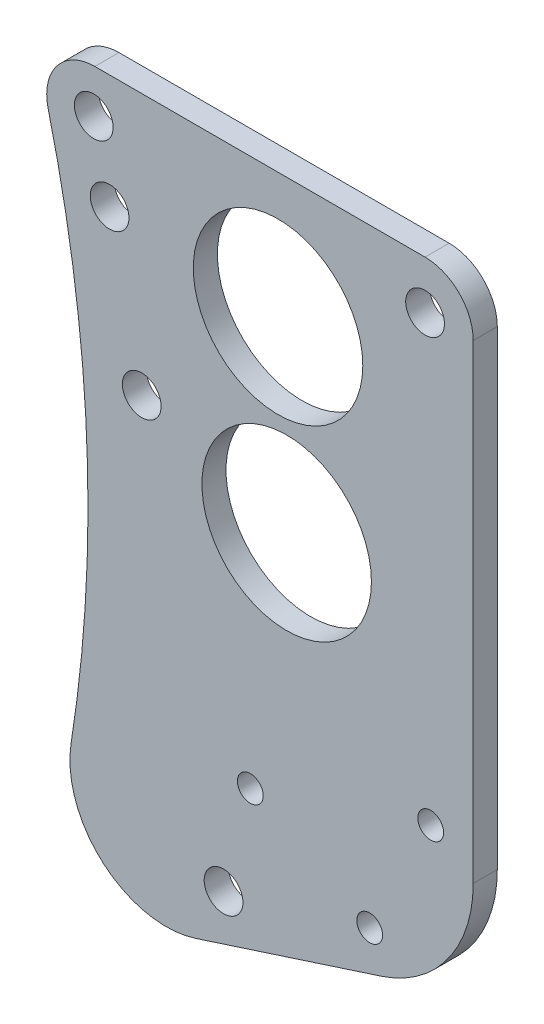
ISO-10303-21;
HEADER;
FILE_DESCRIPTION(('STEP AP214'),'2;1');
FILE_NAME('part.step','',(''),(''),'','','');
FILE_SCHEMA(('AUTOMOTIVE_DESIGN { 1 0 10303 214 1 1 1 1 }'));
ENDSEC;
DATA;
#1=APPLICATION_CONTEXT('core data for automotive mechanical design processes');
#2=APPLICATION_PROTOCOL_DEFINITION('international standard','automotive_design',2000,#1);
#3=PRODUCT_CONTEXT('',#1,'mechanical');
#4=PRODUCT('Part','Part','',(#3));
#5=PRODUCT_RELATED_PRODUCT_CATEGORY('part','',(#4));
#6=PRODUCT_DEFINITION_FORMATION('','',#4);
#7=PRODUCT_DEFINITION_CONTEXT('part definition',#1,'design');
#8=PRODUCT_DEFINITION('design','',#6,#7);
#9=PRODUCT_DEFINITION_SHAPE('','',#8);
#10=(LENGTH_UNIT() NAMED_UNIT(*) SI_UNIT(.MILLI.,.METRE.));
#11=(NAMED_UNIT(*) PLANE_ANGLE_UNIT() SI_UNIT($,.RADIAN.));
#12=(NAMED_UNIT(*) SI_UNIT($,.STERADIAN.) SOLID_ANGLE_UNIT());
#13=UNCERTAINTY_MEASURE_WITH_UNIT(LENGTH_MEASURE(1.E-05),#10,'distance_accuracy_value','');
#14=(GEOMETRIC_REPRESENTATION_CONTEXT(3) GLOBAL_UNCERTAINTY_ASSIGNED_CONTEXT((#13)) GLOBAL_UNIT_ASSIGNED_CONTEXT((#10,
#11,#12)) REPRESENTATION_CONTEXT('',''));
#15=CARTESIAN_POINT('',(0.,0.,0.));
#16=DIRECTION('',(0.,0.,1.));
#17=DIRECTION('',(1.,0.,0.));
#18=AXIS2_PLACEMENT_3D('',#15,#16,#17);
#19=CARTESIAN_POINT('',(122.2,93.8005999767423,3.175));
#20=DIRECTION('',(0.,0.,-1.));
#21=DIRECTION('',(-1.,0.,0.));
#22=AXIS2_PLACEMENT_3D('',#19,#20,#21);
#23=PLANE('',#22);
#24=CARTESIAN_POINT('',(122.2,93.8005999767423,3.175));
#25=DIRECTION('',(0.,0.,1.));
#26=DIRECTION('',(-1.,0.,0.));
#27=AXIS2_PLACEMENT_3D('',#24,#25,#26);
#28=CIRCLE('',#27,17.5000000000001);
#29=CARTESIAN_POINT('',(127.589632634249,77.1512198060617,3.175));
#30=VERTEX_POINT('',#29);
#31=CARTESIAN_POINT('',(139.7,93.8005999767423,3.175));
#32=VERTEX_POINT('',#31);
#33=EDGE_CURVE('E169',#30,#32,#28,.T.);
#34=ORIENTED_EDGE('',*,*,#33,.T.);
#35=DIRECTION('',(0.,1.,0.));
#36=VECTOR('',#35,1.);
#37=CARTESIAN_POINT('',(139.7,155.808224077225,3.175));
#38=LINE('',#37,#36);
#39=CARTESIAN_POINT('',(139.7,155.808224077225,3.175));
#40=VERTEX_POINT('',#39);
#41=EDGE_CURVE('E105',#32,#40,#38,.T.);
#42=ORIENTED_EDGE('',*,*,#41,.T.);
#43=CARTESIAN_POINT('',(133.35,155.808224077225,3.175));
#44=DIRECTION('',(0.,0.,1.));
#45=DIRECTION('',(-1.,0.,0.));
#46=AXIS2_PLACEMENT_3D('',#43,#44,#45);
#47=CIRCLE('',#46,6.34999999999999);
#48=CARTESIAN_POINT('',(133.35,162.158224077225,3.175));
#49=VERTEX_POINT('',#48);
#50=EDGE_CURVE('E190',#40,#49,#47,.T.);
#51=ORIENTED_EDGE('',*,*,#50,.T.);
#52=DIRECTION('',(-1.,0.,0.));
#53=VECTOR('',#52,1.);
#54=CARTESIAN_POINT('',(89.8048404492718,162.158224077225,3.175));
#55=LINE('',#54,#53);
#56=CARTESIAN_POINT('',(89.8048404492718,162.158224077225,3.175));
#57=VERTEX_POINT('',#56);
#58=EDGE_CURVE('E204',#49,#57,#55,.T.);
#59=ORIENTED_EDGE('',*,*,#58,.T.);
#60=CARTESIAN_POINT('',(89.8048404492718,155.808224077225,3.175));
#61=DIRECTION('',(0.,0.,1.));
#62=DIRECTION('',(-1.,0.,0.));
#63=AXIS2_PLACEMENT_3D('',#60,#61,#62);
#64=CIRCLE('',#63,6.35000000000002);
#65=CARTESIAN_POINT('',(83.6426045717097,154.275465456535,3.175));
#66=VERTEX_POINT('',#65);
#67=EDGE_CURVE('E124',#57,#66,#64,.T.);
#68=ORIENTED_EDGE('',*,*,#67,.T.);
#69=CARTESIAN_POINT('',(-88.8999999999996,111.358224077225,3.175));
#70=DIRECTION('',(0.,0.,-1.));
#71=DIRECTION('',(-1.,0.,0.));
#72=AXIS2_PLACEMENT_3D('',#69,#70,#71);
#73=CIRCLE('',#72,177.799999999998);
#74=CARTESIAN_POINT('',(86.6750199580798,83.318032089314,3.175));
#75=VERTEX_POINT('',#74);
#76=EDGE_CURVE('E118',#66,#75,#73,.T.);
#77=ORIENTED_EDGE('',*,*,#76,.T.);
#78=CARTESIAN_POINT('',(99.2160928122292,81.3151612330346,3.175));
#79=DIRECTION('',(0.,0.,1.));
#80=DIRECTION('',(1.,0.,0.));
#81=AXIS2_PLACEMENT_3D('',#78,#79,#80);
#82=CIRCLE('',#81,12.7000000000007);
#83=CARTESIAN_POINT('',(103.127426209655,69.232468194883,3.175));
#84=VERTEX_POINT('',#83);
#85=EDGE_CURVE('E122',#75,#84,#82,.T.);
#86=ORIENTED_EDGE('',*,*,#85,.T.);
#87=DIRECTION('',(0.951393152610311,0.307979007671323,0.));
#88=VECTOR('',#87,1.);
#89=CARTESIAN_POINT('',(127.589632634249,77.1512198060617,3.175));
#90=LINE('',#89,#88);
#91=EDGE_CURVE('E62',#84,#30,#90,.T.);
#92=ORIENTED_EDGE('',*,*,#91,.T.);
#93=EDGE_LOOP('',(#34,#42,#51,#59,#68,#77,#86,#92));
#94=FACE_BOUND('',#93,.T.);
#95=CARTESIAN_POINT('',(89.6578417367833,156.39509402059,3.175));
#96=DIRECTION('',(0.,0.,1.));
#97=DIRECTION('',(1.,0.,0.));
#98=AXIS2_PLACEMENT_3D('',#95,#96,#97);
#99=CIRCLE('',#98,2.5527000000171);
#100=CARTESIAN_POINT('',(92.2105417368004,156.39509402059,3.175));
#101=VERTEX_POINT('',#100);
#102=EDGE_CURVE('E151',#101,#101,#99,.T.);
#103=ORIENTED_EDGE('',*,*,#102,.F.);
#104=EDGE_LOOP('',(#103));
#105=FACE_BOUND('',#104,.T.);
#106=CARTESIAN_POINT('',(91.7477002278783,147.10218723707,3.175));
#107=DIRECTION('',(0.,0.,1.));
#108=DIRECTION('',(1.,0.,0.));
#109=AXIS2_PLACEMENT_3D('',#106,#107,#108);
#110=CIRCLE('',#109,2.55270000001633);
#111=CARTESIAN_POINT('',(94.3004002278947,147.10218723707,3.175));
#112=VERTEX_POINT('',#111);
#113=EDGE_CURVE('E218',#112,#112,#110,.T.);
#114=ORIENTED_EDGE('',*,*,#113,.F.);
#115=EDGE_LOOP('',(#114));
#116=FACE_BOUND('',#115,.T.);
#117=CARTESIAN_POINT('',(106.775437357423,76.4337086436564,3.175));
#118=DIRECTION('',(0.,0.,1.));
#119=DIRECTION('',(1.,0.,0.));
#120=AXIS2_PLACEMENT_3D('',#117,#118,#119);
#121=CIRCLE('',#120,2.55270000000014);
#122=CARTESIAN_POINT('',(109.328137357423,76.4337086436564,3.175));
#123=VERTEX_POINT('',#122);
#124=EDGE_CURVE('E226',#123,#123,#121,.T.);
#125=ORIENTED_EDGE('',*,*,#124,.F.);
#126=EDGE_LOOP('',(#125));
#127=FACE_BOUND('',#126,.T.);
#128=CARTESIAN_POINT('',(115.1001,121.545060725511,3.175));
#129=DIRECTION('',(0.,0.,1.));
#130=DIRECTION('',(1.,0.,0.));
#131=AXIS2_PLACEMENT_3D('',#128,#129,#130);
#132=CIRCLE('',#131,11.1760000000001);
#133=CARTESIAN_POINT('',(126.2761,121.545060725511,3.175));
#134=VERTEX_POINT('',#133);
#135=EDGE_CURVE('E234',#134,#134,#132,.T.);
#136=ORIENTED_EDGE('',*,*,#135,.F.);
#137=EDGE_LOOP('',(#136));
#138=FACE_BOUND('',#137,.T.);
#139=CARTESIAN_POINT('',(113.962375762482,145.648224077224,3.175));
#140=DIRECTION('',(0.,0.,1.));
#141=DIRECTION('',(1.,0.,0.));
#142=AXIS2_PLACEMENT_3D('',#139,#140,#141);
#143=CIRCLE('',#142,11.176);
#144=CARTESIAN_POINT('',(125.138375762482,145.648224077224,3.175));
#145=VERTEX_POINT('',#144);
#146=EDGE_CURVE('E242',#145,#145,#143,.T.);
#147=ORIENTED_EDGE('',*,*,#146,.F.);
#148=EDGE_LOOP('',(#147));
#149=FACE_BOUND('',#148,.T.);
#150=CARTESIAN_POINT('',(95.9884149323465,127.701170500752,3.175));
#151=DIRECTION('',(0.,0.,1.));
#152=DIRECTION('',(1.,0.,0.));
#153=AXIS2_PLACEMENT_3D('',#150,#151,#152);
#154=CIRCLE('',#153,2.55270000000033);
#155=CARTESIAN_POINT('',(98.5411149323469,127.701170500752,3.175));
#156=VERTEX_POINT('',#155);
#157=EDGE_CURVE('E250',#156,#156,#154,.T.);
#158=ORIENTED_EDGE('',*,*,#157,.F.);
#159=EDGE_LOOP('',(#158));
#160=FACE_BOUND('',#159,.T.);
#161=CARTESIAN_POINT('',(126.045534429459,81.9068257670201,3.175));
#162=DIRECTION('',(0.,0.,1.));
#163=DIRECTION('',(1.,0.,0.));
#164=AXIS2_PLACEMENT_3D('',#161,#162,#163);
#165=CIRCLE('',#164,1.70000000000001);
#166=CARTESIAN_POINT('',(127.745534429459,81.9068257670201,3.175));
#167=VERTEX_POINT('',#166);
#168=EDGE_CURVE('E258',#167,#167,#165,.T.);
#169=ORIENTED_EDGE('',*,*,#168,.F.);
#170=EDGE_LOOP('',(#169));
#171=FACE_BOUND('',#170,.T.);
#172=CARTESIAN_POINT('',(133.35,155.808224077225,3.175));
#173=DIRECTION('',(0.,0.,1.));
#174=DIRECTION('',(1.,0.,0.));
#175=AXIS2_PLACEMENT_3D('',#172,#173,#174);
#176=CIRCLE('',#175,2.55269999999999);
#177=CARTESIAN_POINT('',(135.9027,155.808224077225,3.175));
#178=VERTEX_POINT('',#177);
#179=EDGE_CURVE('E266',#178,#178,#176,.T.);
#180=ORIENTED_EDGE('',*,*,#179,.F.);
#181=EDGE_LOOP('',(#180));
#182=FACE_BOUND('',#181,.T.);
#183=CARTESIAN_POINT('',(134.093774209722,97.646134406201,3.175));
#184=DIRECTION('',(0.,0.,1.));
#185=DIRECTION('',(1.,0.,0.));
#186=AXIS2_PLACEMENT_3D('',#183,#184,#185);
#187=CIRCLE('',#186,1.70000000000004);
#188=CARTESIAN_POINT('',(135.793774209722,97.646134406201,3.175));
#189=VERTEX_POINT('',#188);
#190=EDGE_CURVE('E274',#189,#189,#187,.T.);
#191=ORIENTED_EDGE('',*,*,#190,.F.);
#192=EDGE_LOOP('',(#191));
#193=FACE_BOUND('',#192,.T.);
#194=CARTESIAN_POINT('',(110.306225790279,89.955065547283,3.175));
#195=DIRECTION('',(0.,0.,1.));
#196=DIRECTION('',(1.,0.,0.));
#197=AXIS2_PLACEMENT_3D('',#194,#195,#196);
#198=CIRCLE('',#197,1.7);
#199=CARTESIAN_POINT('',(112.006225790279,89.955065547283,3.175));
#200=VERTEX_POINT('',#199);
#201=EDGE_CURVE('E282',#200,#200,#198,.T.);
#202=ORIENTED_EDGE('',*,*,#201,.F.);
#203=EDGE_LOOP('',(#202));
#204=FACE_BOUND('',#203,.T.);
#205=ADVANCED_FACE('F44',(#94,#105,#116,#127,#138,#149,#160,#171,#182,#193,#204),#23,.F.);
#206=CARTESIAN_POINT('',(122.2,93.8005999767423,0.));
#207=DIRECTION('',(0.,0.,-1.));
#208=DIRECTION('',(-1.,0.,0.));
#209=AXIS2_PLACEMENT_3D('',#206,#207,#208);
#210=PLANE('',#209);
#211=CARTESIAN_POINT('',(134.093774209722,97.646134406201,0.));
#212=DIRECTION('',(0.,0.,1.));
#213=DIRECTION('',(1.,0.,0.));
#214=AXIS2_PLACEMENT_3D('',#211,#212,#213);
#215=CIRCLE('',#214,1.70000000000004);
#216=CARTESIAN_POINT('',(135.793774209722,97.646134406201,0.));
#217=VERTEX_POINT('',#216);
#218=EDGE_CURVE('E278',#217,#217,#215,.T.);
#219=ORIENTED_EDGE('',*,*,#218,.T.);
#220=EDGE_LOOP('',(#219));
#221=FACE_BOUND('',#220,.T.);
#222=CARTESIAN_POINT('',(126.045534429459,81.9068257670201,0.));
#223=DIRECTION('',(0.,0.,1.));
#224=DIRECTION('',(1.,0.,0.));
#225=AXIS2_PLACEMENT_3D('',#222,#223,#224);
#226=CIRCLE('',#225,1.70000000000001);
#227=CARTESIAN_POINT('',(127.745534429459,81.9068257670201,0.));
#228=VERTEX_POINT('',#227);
#229=EDGE_CURVE('E262',#228,#228,#226,.T.);
#230=ORIENTED_EDGE('',*,*,#229,.T.);
#231=EDGE_LOOP('',(#230));
#232=FACE_BOUND('',#231,.T.);
#233=CARTESIAN_POINT('',(113.962375762482,145.648224077224,0.));
#234=DIRECTION('',(0.,0.,1.));
#235=DIRECTION('',(1.,0.,0.));
#236=AXIS2_PLACEMENT_3D('',#233,#234,#235);
#237=CIRCLE('',#236,11.176);
#238=CARTESIAN_POINT('',(125.138375762482,145.648224077224,0.));
#239=VERTEX_POINT('',#238);
#240=EDGE_CURVE('E246',#239,#239,#237,.T.);
#241=ORIENTED_EDGE('',*,*,#240,.T.);
#242=EDGE_LOOP('',(#241));
#243=FACE_BOUND('',#242,.T.);
#244=CARTESIAN_POINT('',(106.775437357423,76.4337086436564,0.));
#245=DIRECTION('',(0.,0.,1.));
#246=DIRECTION('',(1.,0.,0.));
#247=AXIS2_PLACEMENT_3D('',#244,#245,#246);
#248=CIRCLE('',#247,2.55270000000014);
#249=CARTESIAN_POINT('',(109.328137357423,76.4337086436564,0.));
#250=VERTEX_POINT('',#249);
#251=EDGE_CURVE('E230',#250,#250,#248,.T.);
#252=ORIENTED_EDGE('',*,*,#251,.T.);
#253=EDGE_LOOP('',(#252));
#254=FACE_BOUND('',#253,.T.);
#255=CARTESIAN_POINT('',(89.6578417367833,156.39509402059,0.));
#256=DIRECTION('',(0.,0.,1.));
#257=DIRECTION('',(1.,0.,0.));
#258=AXIS2_PLACEMENT_3D('',#255,#256,#257);
#259=CIRCLE('',#258,2.5527000000171);
#260=CARTESIAN_POINT('',(92.2105417368004,156.39509402059,0.));
#261=VERTEX_POINT('',#260);
#262=EDGE_CURVE('E214',#261,#261,#259,.T.);
#263=ORIENTED_EDGE('',*,*,#262,.T.);
#264=EDGE_LOOP('',(#263));
#265=FACE_BOUND('',#264,.T.);
#266=CARTESIAN_POINT('',(122.2,93.8005999767423,0.));
#267=DIRECTION('',(0.,0.,1.));
#268=DIRECTION('',(-1.,0.,0.));
#269=AXIS2_PLACEMENT_3D('',#266,#267,#268);
#270=CIRCLE('',#269,17.5000000000001);
#271=CARTESIAN_POINT('',(127.589632634249,77.1512198060617,0.));
#272=VERTEX_POINT('',#271);
#273=CARTESIAN_POINT('',(139.7,93.8005999767423,0.));
#274=VERTEX_POINT('',#273);
#275=EDGE_CURVE('E146',#272,#274,#270,.T.);
#276=ORIENTED_EDGE('',*,*,#275,.F.);
#277=DIRECTION('',(0.951393152610311,0.307979007671323,0.));
#278=VECTOR('',#277,1.);
#279=CARTESIAN_POINT('',(127.589632634249,77.1512198060617,0.));
#280=LINE('',#279,#278);
#281=CARTESIAN_POINT('',(103.127426209655,69.232468194883,0.));
#282=VERTEX_POINT('',#281);
#283=EDGE_CURVE('E97',#282,#272,#280,.T.);
#284=ORIENTED_EDGE('',*,*,#283,.F.);
#285=CARTESIAN_POINT('',(99.2160928122292,81.3151612330346,0.));
#286=DIRECTION('',(0.,0.,1.));
#287=DIRECTION('',(1.,0.,0.));
#288=AXIS2_PLACEMENT_3D('',#285,#286,#287);
#289=CIRCLE('',#288,12.7000000000007);
#290=CARTESIAN_POINT('',(86.6750199580798,83.318032089314,0.));
#291=VERTEX_POINT('',#290);
#292=EDGE_CURVE('E91',#291,#282,#289,.T.);
#293=ORIENTED_EDGE('',*,*,#292,.F.);
#294=CARTESIAN_POINT('',(-88.8999999999996,111.358224077225,0.));
#295=DIRECTION('',(0.,0.,-1.));
#296=DIRECTION('',(-1.,0.,0.));
#297=AXIS2_PLACEMENT_3D('',#294,#295,#296);
#298=CIRCLE('',#297,177.799999999998);
#299=CARTESIAN_POINT('',(83.6426045717097,154.275465456535,0.));
#300=VERTEX_POINT('',#299);
#301=EDGE_CURVE('E133',#300,#291,#298,.T.);
#302=ORIENTED_EDGE('',*,*,#301,.F.);
#303=CARTESIAN_POINT('',(89.8048404492718,155.808224077225,0.));
#304=DIRECTION('',(0.,0.,1.));
#305=DIRECTION('',(-1.,0.,0.));
#306=AXIS2_PLACEMENT_3D('',#303,#304,#305);
#307=CIRCLE('',#306,6.35000000000002);
#308=CARTESIAN_POINT('',(89.8048404492718,162.158224077225,0.));
#309=VERTEX_POINT('',#308);
#310=EDGE_CURVE('E160',#309,#300,#307,.T.);
#311=ORIENTED_EDGE('',*,*,#310,.F.);
#312=DIRECTION('',(-1.,0.,0.));
#313=VECTOR('',#312,1.);
#314=CARTESIAN_POINT('',(89.8048404492718,162.158224077225,0.));
#315=LINE('',#314,#313);
#316=CARTESIAN_POINT('',(133.35,162.158224077225,0.));
#317=VERTEX_POINT('',#316);
#318=EDGE_CURVE('E157',#317,#309,#315,.T.);
#319=ORIENTED_EDGE('',*,*,#318,.F.);
#320=CARTESIAN_POINT('',(133.35,155.808224077225,0.));
#321=DIRECTION('',(0.,0.,1.));
#322=DIRECTION('',(-1.,0.,0.));
#323=AXIS2_PLACEMENT_3D('',#320,#321,#322);
#324=CIRCLE('',#323,6.34999999999999);
#325=CARTESIAN_POINT('',(139.7,155.808224077225,0.));
#326=VERTEX_POINT('',#325);
#327=EDGE_CURVE('E154',#326,#317,#324,.T.);
#328=ORIENTED_EDGE('',*,*,#327,.F.);
#329=DIRECTION('',(0.,1.,0.));
#330=VECTOR('',#329,1.);
#331=CARTESIAN_POINT('',(139.7,155.808224077225,0.));
#332=LINE('',#331,#330);
#333=EDGE_CURVE('E150',#274,#326,#332,.T.);
#334=ORIENTED_EDGE('',*,*,#333,.F.);
#335=EDGE_LOOP('',(#276,#284,#293,#302,#311,#319,#328,#334));
#336=FACE_BOUND('',#335,.T.);
#337=CARTESIAN_POINT('',(91.7477002278783,147.10218723707,0.));
#338=DIRECTION('',(0.,0.,1.));
#339=DIRECTION('',(1.,0.,0.));
#340=AXIS2_PLACEMENT_3D('',#337,#338,#339);
#341=CIRCLE('',#340,2.55270000001633);
#342=CARTESIAN_POINT('',(94.3004002278947,147.10218723707,0.));
#343=VERTEX_POINT('',#342);
#344=EDGE_CURVE('E222',#343,#343,#341,.T.);
#345=ORIENTED_EDGE('',*,*,#344,.T.);
#346=EDGE_LOOP('',(#345));
#347=FACE_BOUND('',#346,.T.);
#348=CARTESIAN_POINT('',(115.1001,121.545060725511,0.));
#349=DIRECTION('',(0.,0.,1.));
#350=DIRECTION('',(1.,0.,0.));
#351=AXIS2_PLACEMENT_3D('',#348,#349,#350);
#352=CIRCLE('',#351,11.1760000000001);
#353=CARTESIAN_POINT('',(126.2761,121.545060725511,0.));
#354=VERTEX_POINT('',#353);
#355=EDGE_CURVE('E238',#354,#354,#352,.T.);
#356=ORIENTED_EDGE('',*,*,#355,.T.);
#357=EDGE_LOOP('',(#356));
#358=FACE_BOUND('',#357,.T.);
#359=CARTESIAN_POINT('',(95.9884149323465,127.701170500752,0.));
#360=DIRECTION('',(0.,0.,1.));
#361=DIRECTION('',(1.,0.,0.));
#362=AXIS2_PLACEMENT_3D('',#359,#360,#361);
#363=CIRCLE('',#362,2.55270000000033);
#364=CARTESIAN_POINT('',(98.5411149323469,127.701170500752,0.));
#365=VERTEX_POINT('',#364);
#366=EDGE_CURVE('E254',#365,#365,#363,.T.);
#367=ORIENTED_EDGE('',*,*,#366,.T.);
#368=EDGE_LOOP('',(#367));
#369=FACE_BOUND('',#368,.T.);
#370=CARTESIAN_POINT('',(133.35,155.808224077225,0.));
#371=DIRECTION('',(0.,0.,1.));
#372=DIRECTION('',(1.,0.,0.));
#373=AXIS2_PLACEMENT_3D('',#370,#371,#372);
#374=CIRCLE('',#373,2.55269999999999);
#375=CARTESIAN_POINT('',(135.9027,155.808224077225,0.));
#376=VERTEX_POINT('',#375);
#377=EDGE_CURVE('E270',#376,#376,#374,.T.);
#378=ORIENTED_EDGE('',*,*,#377,.T.);
#379=EDGE_LOOP('',(#378));
#380=FACE_BOUND('',#379,.T.);
#381=CARTESIAN_POINT('',(110.306225790279,89.955065547283,0.));
#382=DIRECTION('',(0.,0.,1.));
#383=DIRECTION('',(1.,0.,0.));
#384=AXIS2_PLACEMENT_3D('',#381,#382,#383);
#385=CIRCLE('',#384,1.7);
#386=CARTESIAN_POINT('',(112.006225790279,89.955065547283,0.));
#387=VERTEX_POINT('',#386);
#388=EDGE_CURVE('E286',#387,#387,#385,.T.);
#389=ORIENTED_EDGE('',*,*,#388,.T.);
#390=EDGE_LOOP('',(#389));
#391=FACE_BOUND('',#390,.T.);
#392=ADVANCED_FACE('F194',(#221,#232,#243,#254,#265,#336,#347,#358,#369,#380,#391),#210,.T.);
#393=CARTESIAN_POINT('',(122.2,93.8005999767423,3.175));
#394=DIRECTION('',(0.,0.,-1.));
#395=DIRECTION('',(-1.,0.,0.));
#396=AXIS2_PLACEMENT_3D('',#393,#394,#395);
#397=CYLINDRICAL_SURFACE('',#396,17.5000000000001);
#398=ORIENTED_EDGE('',*,*,#275,.T.);
#399=DIRECTION('',(0.,0.,-1.));
#400=VECTOR('',#399,1.);
#401=CARTESIAN_POINT('',(139.7,93.8005999767423,3.175));
#402=LINE('',#401,#400);
#403=EDGE_CURVE('E11',#32,#274,#402,.T.);
#404=ORIENTED_EDGE('',*,*,#403,.F.);
#405=ORIENTED_EDGE('',*,*,#33,.F.);
#406=DIRECTION('',(0.,0.,-1.));
#407=VECTOR('',#406,1.);
#408=CARTESIAN_POINT('',(127.589632634249,77.1512198060617,3.175));
#409=LINE('',#408,#407);
#410=EDGE_CURVE('E142',#30,#272,#409,.T.);
#411=ORIENTED_EDGE('',*,*,#410,.T.);
#412=EDGE_LOOP('',(#398,#404,#405,#411));
#413=FACE_BOUND('',#412,.T.);
#414=ADVANCED_FACE('F46',(#413),#397,.T.);
#415=CARTESIAN_POINT('',(139.7,155.808224077225,3.175));
#416=DIRECTION('',(-1.,0.,0.));
#417=DIRECTION('',(0.,-1.,0.));
#418=AXIS2_PLACEMENT_3D('',#415,#416,#417);
#419=PLANE('',#418);
#420=ORIENTED_EDGE('',*,*,#333,.T.);
#421=DIRECTION('',(0.,0.,-1.));
#422=VECTOR('',#421,1.);
#423=CARTESIAN_POINT('',(139.7,155.808224077225,3.175));
#424=LINE('',#423,#422);
#425=EDGE_CURVE('E54',#40,#326,#424,.T.);
#426=ORIENTED_EDGE('',*,*,#425,.F.);
#427=ORIENTED_EDGE('',*,*,#41,.F.);
#428=ORIENTED_EDGE('',*,*,#403,.T.);
#429=EDGE_LOOP('',(#420,#426,#427,#428));
#430=FACE_BOUND('',#429,.T.);
#431=ADVANCED_FACE('F320',(#430),#419,.F.);
#432=CARTESIAN_POINT('',(133.35,155.808224077225,3.175));
#433=DIRECTION('',(0.,0.,-1.));
#434=DIRECTION('',(-1.,0.,0.));
#435=AXIS2_PLACEMENT_3D('',#432,#433,#434);
#436=CYLINDRICAL_SURFACE('',#435,6.34999999999999);
#437=ORIENTED_EDGE('',*,*,#327,.T.);
#438=DIRECTION('',(0.,0.,-1.));
#439=VECTOR('',#438,1.);
#440=CARTESIAN_POINT('',(133.35,162.158224077225,3.175));
#441=LINE('',#440,#439);
#442=EDGE_CURVE('E180',#49,#317,#441,.T.);
#443=ORIENTED_EDGE('',*,*,#442,.F.);
#444=ORIENTED_EDGE('',*,*,#50,.F.);
#445=ORIENTED_EDGE('',*,*,#425,.T.);
#446=EDGE_LOOP('',(#437,#443,#444,#445));
#447=FACE_BOUND('',#446,.T.);
#448=ADVANCED_FACE('F188',(#447),#436,.T.);
#449=CARTESIAN_POINT('',(89.8048404492718,162.158224077225,3.175));
#450=DIRECTION('',(0.,-1.,0.));
#451=DIRECTION('',(1.,0.,0.));
#452=AXIS2_PLACEMENT_3D('',#449,#450,#451);
#453=PLANE('',#452);
#454=ORIENTED_EDGE('',*,*,#318,.T.);
#455=DIRECTION('',(0.,0.,-1.));
#456=VECTOR('',#455,1.);
#457=CARTESIAN_POINT('',(89.8048404492718,162.158224077225,3.175));
#458=LINE('',#457,#456);
#459=EDGE_CURVE('E176',#57,#309,#458,.T.);
#460=ORIENTED_EDGE('',*,*,#459,.F.);
#461=ORIENTED_EDGE('',*,*,#58,.F.);
#462=ORIENTED_EDGE('',*,*,#442,.T.);
#463=EDGE_LOOP('',(#454,#460,#461,#462));
#464=FACE_BOUND('',#463,.T.);
#465=ADVANCED_FACE('F199',(#464),#453,.F.);
#466=CARTESIAN_POINT('',(89.8048404492718,155.808224077225,3.175));
#467=DIRECTION('',(0.,0.,-1.));
#468=DIRECTION('',(-1.,0.,0.));
#469=AXIS2_PLACEMENT_3D('',#466,#467,#468);
#470=CYLINDRICAL_SURFACE('',#469,6.35000000000002);
#471=ORIENTED_EDGE('',*,*,#310,.T.);
#472=DIRECTION('',(0.,0.,-1.));
#473=VECTOR('',#472,1.);
#474=CARTESIAN_POINT('',(83.6426045717097,154.275465456535,3.175));
#475=LINE('',#474,#473);
#476=EDGE_CURVE('E135',#66,#300,#475,.T.);
#477=ORIENTED_EDGE('',*,*,#476,.F.);
#478=ORIENTED_EDGE('',*,*,#67,.F.);
#479=ORIENTED_EDGE('',*,*,#459,.T.);
#480=EDGE_LOOP('',(#471,#477,#478,#479));
#481=FACE_BOUND('',#480,.T.);
#482=ADVANCED_FACE('F202',(#481),#470,.T.);
#483=CARTESIAN_POINT('',(-88.8999999999996,111.358224077225,3.175));
#484=DIRECTION('',(0.,0.,-1.));
#485=DIRECTION('',(-1.,0.,0.));
#486=AXIS2_PLACEMENT_3D('',#483,#484,#485);
#487=CYLINDRICAL_SURFACE('',#486,177.799999999998);
#488=ORIENTED_EDGE('',*,*,#301,.T.);
#489=DIRECTION('',(0.,0.,-1.));
#490=VECTOR('',#489,1.);
#491=CARTESIAN_POINT('',(86.6750199580798,83.318032089314,3.175));
#492=LINE('',#491,#490);
#493=EDGE_CURVE('E130',#75,#291,#492,.T.);
#494=ORIENTED_EDGE('',*,*,#493,.F.);
#495=ORIENTED_EDGE('',*,*,#76,.F.);
#496=ORIENTED_EDGE('',*,*,#476,.T.);
#497=EDGE_LOOP('',(#488,#494,#495,#496));
#498=FACE_BOUND('',#497,.T.);
#499=ADVANCED_FACE('F131',(#498),#487,.F.);
#500=CARTESIAN_POINT('',(99.2160928122292,81.3151612330346,3.175));
#501=DIRECTION('',(0.,0.,-1.));
#502=DIRECTION('',(-1.,0.,0.));
#503=AXIS2_PLACEMENT_3D('',#500,#501,#502);
#504=CYLINDRICAL_SURFACE('',#503,12.7000000000007);
#505=ORIENTED_EDGE('',*,*,#292,.T.);
#506=DIRECTION('',(0.,0.,-1.));
#507=VECTOR('',#506,1.);
#508=CARTESIAN_POINT('',(103.127426209655,69.232468194883,3.175));
#509=LINE('',#508,#507);
#510=EDGE_CURVE('E136',#84,#282,#509,.T.);
#511=ORIENTED_EDGE('',*,*,#510,.F.);
#512=ORIENTED_EDGE('',*,*,#85,.F.);
#513=ORIENTED_EDGE('',*,*,#493,.T.);
#514=EDGE_LOOP('',(#505,#511,#512,#513));
#515=FACE_BOUND('',#514,.T.);
#516=ADVANCED_FACE('F138',(#515),#504,.T.);
#517=CARTESIAN_POINT('',(127.589632634249,77.1512198060617,3.175));
#518=DIRECTION('',(-0.307979007671323,0.951393152610311,0.));
#519=DIRECTION('',(-0.951393152610311,-0.307979007671323,0.));
#520=AXIS2_PLACEMENT_3D('',#517,#518,#519);
#521=PLANE('',#520);
#522=ORIENTED_EDGE('',*,*,#283,.T.);
#523=ORIENTED_EDGE('',*,*,#410,.F.);
#524=ORIENTED_EDGE('',*,*,#91,.F.);
#525=ORIENTED_EDGE('',*,*,#510,.T.);
#526=EDGE_LOOP('',(#522,#523,#524,#525));
#527=FACE_BOUND('',#526,.T.);
#528=ADVANCED_FACE('F308',(#527),#521,.F.);
#529=CARTESIAN_POINT('',(89.6578417367833,156.39509402059,3.175));
#530=DIRECTION('',(0.,0.,-1.));
#531=DIRECTION('',(-1.,0.,0.));
#532=AXIS2_PLACEMENT_3D('',#529,#530,#531);
#533=CYLINDRICAL_SURFACE('',#532,2.5527000000171);
#534=ORIENTED_EDGE('',*,*,#102,.T.);
#535=EDGE_LOOP('',(#534));
#536=FACE_BOUND('',#535,.T.);
#537=ORIENTED_EDGE('',*,*,#262,.F.);
#538=EDGE_LOOP('',(#537));
#539=FACE_BOUND('',#538,.T.);
#540=ADVANCED_FACE('F305',(#536,#539),#533,.F.);
#541=CARTESIAN_POINT('',(91.7477002278783,147.10218723707,3.175));
#542=DIRECTION('',(0.,0.,-1.));
#543=DIRECTION('',(-1.,0.,0.));
#544=AXIS2_PLACEMENT_3D('',#541,#542,#543);
#545=CYLINDRICAL_SURFACE('',#544,2.55270000001633);
#546=ORIENTED_EDGE('',*,*,#113,.T.);
#547=EDGE_LOOP('',(#546));
#548=FACE_BOUND('',#547,.T.);
#549=ORIENTED_EDGE('',*,*,#344,.F.);
#550=EDGE_LOOP('',(#549));
#551=FACE_BOUND('',#550,.T.);
#552=ADVANCED_FACE('F383',(#548,#551),#545,.F.);
#553=CARTESIAN_POINT('',(106.775437357423,76.4337086436564,3.175));
#554=DIRECTION('',(0.,0.,-1.));
#555=DIRECTION('',(-1.,0.,0.));
#556=AXIS2_PLACEMENT_3D('',#553,#554,#555);
#557=CYLINDRICAL_SURFACE('',#556,2.55270000000014);
#558=ORIENTED_EDGE('',*,*,#124,.T.);
#559=EDGE_LOOP('',(#558));
#560=FACE_BOUND('',#559,.T.);
#561=ORIENTED_EDGE('',*,*,#251,.F.);
#562=EDGE_LOOP('',(#561));
#563=FACE_BOUND('',#562,.T.);
#564=ADVANCED_FACE('F391',(#560,#563),#557,.F.);
#565=CARTESIAN_POINT('',(115.1001,121.545060725511,3.175));
#566=DIRECTION('',(0.,0.,-1.));
#567=DIRECTION('',(-1.,0.,0.));
#568=AXIS2_PLACEMENT_3D('',#565,#566,#567);
#569=CYLINDRICAL_SURFACE('',#568,11.1760000000001);
#570=ORIENTED_EDGE('',*,*,#135,.T.);
#571=EDGE_LOOP('',(#570));
#572=FACE_BOUND('',#571,.T.);
#573=ORIENTED_EDGE('',*,*,#355,.F.);
#574=EDGE_LOOP('',(#573));
#575=FACE_BOUND('',#574,.T.);
#576=ADVANCED_FACE('F399',(#572,#575),#569,.F.);
#577=CARTESIAN_POINT('',(113.962375762482,145.648224077224,3.175));
#578=DIRECTION('',(0.,0.,-1.));
#579=DIRECTION('',(-1.,0.,0.));
#580=AXIS2_PLACEMENT_3D('',#577,#578,#579);
#581=CYLINDRICAL_SURFACE('',#580,11.176);
#582=ORIENTED_EDGE('',*,*,#146,.T.);
#583=EDGE_LOOP('',(#582));
#584=FACE_BOUND('',#583,.T.);
#585=ORIENTED_EDGE('',*,*,#240,.F.);
#586=EDGE_LOOP('',(#585));
#587=FACE_BOUND('',#586,.T.);
#588=ADVANCED_FACE('F408',(#584,#587),#581,.F.);
#589=CARTESIAN_POINT('',(95.9884149323465,127.701170500752,3.175));
#590=DIRECTION('',(0.,0.,-1.));
#591=DIRECTION('',(-1.,0.,0.));
#592=AXIS2_PLACEMENT_3D('',#589,#590,#591);
#593=CYLINDRICAL_SURFACE('',#592,2.55270000000033);
#594=ORIENTED_EDGE('',*,*,#157,.T.);
#595=EDGE_LOOP('',(#594));
#596=FACE_BOUND('',#595,.T.);
#597=ORIENTED_EDGE('',*,*,#366,.F.);
#598=EDGE_LOOP('',(#597));
#599=FACE_BOUND('',#598,.T.);
#600=ADVANCED_FACE('F417',(#596,#599),#593,.F.);
#601=CARTESIAN_POINT('',(126.045534429459,81.9068257670201,3.175));
#602=DIRECTION('',(0.,0.,-1.));
#603=DIRECTION('',(-1.,0.,0.));
#604=AXIS2_PLACEMENT_3D('',#601,#602,#603);
#605=CYLINDRICAL_SURFACE('',#604,1.70000000000001);
#606=ORIENTED_EDGE('',*,*,#168,.T.);
#607=EDGE_LOOP('',(#606));
#608=FACE_BOUND('',#607,.T.);
#609=ORIENTED_EDGE('',*,*,#229,.F.);
#610=EDGE_LOOP('',(#609));
#611=FACE_BOUND('',#610,.T.);
#612=ADVANCED_FACE('F426',(#608,#611),#605,.F.);
#613=CARTESIAN_POINT('',(133.35,155.808224077225,3.175));
#614=DIRECTION('',(0.,0.,-1.));
#615=DIRECTION('',(-1.,0.,0.));
#616=AXIS2_PLACEMENT_3D('',#613,#614,#615);
#617=CYLINDRICAL_SURFACE('',#616,2.55269999999999);
#618=ORIENTED_EDGE('',*,*,#179,.T.);
#619=EDGE_LOOP('',(#618));
#620=FACE_BOUND('',#619,.T.);
#621=ORIENTED_EDGE('',*,*,#377,.F.);
#622=EDGE_LOOP('',(#621));
#623=FACE_BOUND('',#622,.T.);
#624=ADVANCED_FACE('F435',(#620,#623),#617,.F.);
#625=CARTESIAN_POINT('',(134.093774209722,97.646134406201,3.175));
#626=DIRECTION('',(0.,0.,-1.));
#627=DIRECTION('',(-1.,0.,0.));
#628=AXIS2_PLACEMENT_3D('',#625,#626,#627);
#629=CYLINDRICAL_SURFACE('',#628,1.70000000000004);
#630=ORIENTED_EDGE('',*,*,#190,.T.);
#631=EDGE_LOOP('',(#630));
#632=FACE_BOUND('',#631,.T.);
#633=ORIENTED_EDGE('',*,*,#218,.F.);
#634=EDGE_LOOP('',(#633));
#635=FACE_BOUND('',#634,.T.);
#636=ADVANCED_FACE('F444',(#632,#635),#629,.F.);
#637=CARTESIAN_POINT('',(110.306225790279,89.955065547283,3.175));
#638=DIRECTION('',(0.,0.,-1.));
#639=DIRECTION('',(-1.,0.,0.));
#640=AXIS2_PLACEMENT_3D('',#637,#638,#639);
#641=CYLINDRICAL_SURFACE('',#640,1.7);
#642=ORIENTED_EDGE('',*,*,#201,.T.);
#643=EDGE_LOOP('',(#642));
#644=FACE_BOUND('',#643,.T.);
#645=ORIENTED_EDGE('',*,*,#388,.F.);
#646=EDGE_LOOP('',(#645));
#647=FACE_BOUND('',#646,.T.);
#648=ADVANCED_FACE('F294',(#644,#647),#641,.F.);
#649=CLOSED_SHELL('',(#205,#392,#414,#431,#448,#465,#482,#499,#516,#528,#540,#552,#564,#576,
#588,#600,#612,#624,#636,#648));
#650=MANIFOLD_SOLID_BREP('B2',#649);
#651=ADVANCED_BREP_SHAPE_REPRESENTATION('',(#18,#650),#14);
#652=SHAPE_DEFINITION_REPRESENTATION(#9,#651);
ENDSEC;
END-ISO-10303-21;
